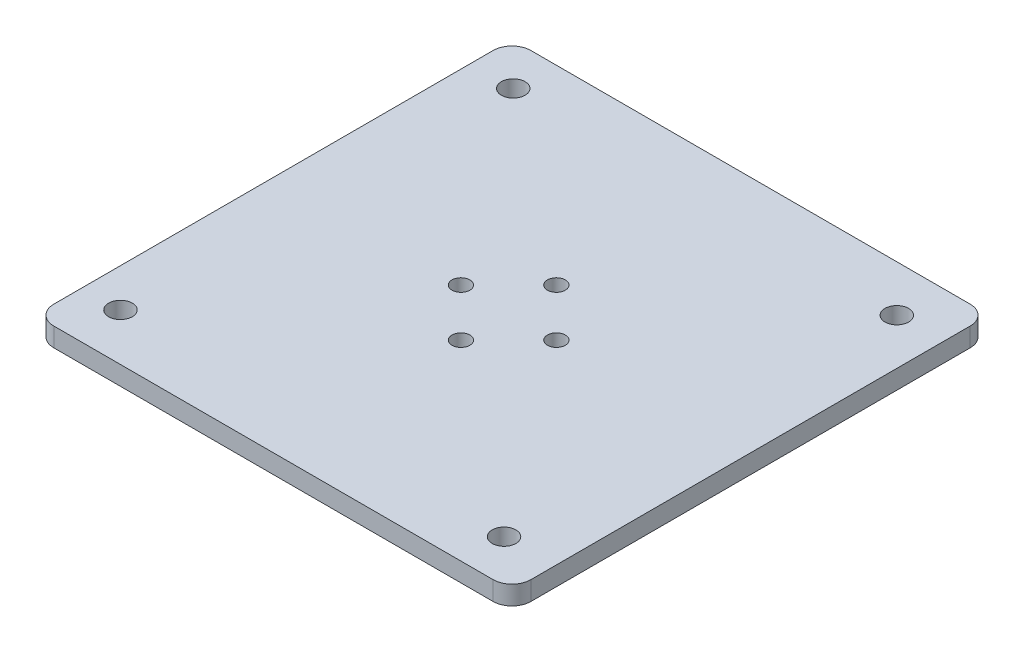
ISO-10303-21;
HEADER;
FILE_DESCRIPTION(('STEP AP214'),'2;1');
FILE_NAME('part.step','',(''),(''),'','','');
FILE_SCHEMA(('AUTOMOTIVE_DESIGN { 1 0 10303 214 1 1 1 1 }'));
ENDSEC;
DATA;
#1=APPLICATION_CONTEXT('core data for automotive mechanical design processes');
#2=APPLICATION_PROTOCOL_DEFINITION('international standard','automotive_design',2000,#1);
#3=PRODUCT_CONTEXT('',#1,'mechanical');
#4=PRODUCT('Part','Part','',(#3));
#5=PRODUCT_RELATED_PRODUCT_CATEGORY('part','',(#4));
#6=PRODUCT_DEFINITION_FORMATION('','',#4);
#7=PRODUCT_DEFINITION_CONTEXT('part definition',#1,'design');
#8=PRODUCT_DEFINITION('design','',#6,#7);
#9=PRODUCT_DEFINITION_SHAPE('','',#8);
#10=(LENGTH_UNIT() NAMED_UNIT(*) SI_UNIT(.MILLI.,.METRE.));
#11=(NAMED_UNIT(*) PLANE_ANGLE_UNIT() SI_UNIT($,.RADIAN.));
#12=(NAMED_UNIT(*) SI_UNIT($,.STERADIAN.) SOLID_ANGLE_UNIT());
#13=UNCERTAINTY_MEASURE_WITH_UNIT(LENGTH_MEASURE(1.E-05),#10,'distance_accuracy_value','');
#14=(GEOMETRIC_REPRESENTATION_CONTEXT(3) GLOBAL_UNCERTAINTY_ASSIGNED_CONTEXT((#13)) GLOBAL_UNIT_ASSIGNED_CONTEXT((#10,
#11,#12)) REPRESENTATION_CONTEXT('',''));
#15=CARTESIAN_POINT('',(0.,0.,0.));
#16=DIRECTION('',(0.,0.,1.));
#17=DIRECTION('',(1.,0.,0.));
#18=AXIS2_PLACEMENT_3D('',#15,#16,#17);
#19=CARTESIAN_POINT('',(-40.,3.175,40.));
#20=DIRECTION('',(1.,0.,0.));
#21=DIRECTION('',(0.,0.,-1.));
#22=AXIS2_PLACEMENT_3D('',#19,#20,#21);
#23=PLANE('',#22);
#24=DIRECTION('',(0.,0.,1.));
#25=VECTOR('',#24,1.);
#26=CARTESIAN_POINT('',(-40.,3.175,40.));
#27=LINE('',#26,#25);
#28=CARTESIAN_POINT('',(-40.,3.175,-36.825));
#29=VERTEX_POINT('',#28);
#30=CARTESIAN_POINT('',(-40.,3.175,36.825));
#31=VERTEX_POINT('',#30);
#32=EDGE_CURVE('E140',#29,#31,#27,.T.);
#33=ORIENTED_EDGE('',*,*,#32,.F.);
#34=DIRECTION('',(0.,-1.,0.));
#35=VECTOR('',#34,1.);
#36=CARTESIAN_POINT('',(-40.,3.175,-36.825));
#37=LINE('',#36,#35);
#38=CARTESIAN_POINT('',(-40.,0.,-36.825));
#39=VERTEX_POINT('',#38);
#40=EDGE_CURVE('E124',#29,#39,#37,.T.);
#41=ORIENTED_EDGE('',*,*,#40,.T.);
#42=DIRECTION('',(0.,0.,1.));
#43=VECTOR('',#42,1.);
#44=CARTESIAN_POINT('',(-40.,0.,40.));
#45=LINE('',#44,#43);
#46=CARTESIAN_POINT('',(-40.,0.,36.825));
#47=VERTEX_POINT('',#46);
#48=EDGE_CURVE('E137',#39,#47,#45,.T.);
#49=ORIENTED_EDGE('',*,*,#48,.T.);
#50=DIRECTION('',(0.,-1.,0.));
#51=VECTOR('',#50,1.);
#52=CARTESIAN_POINT('',(-40.,3.175,36.825));
#53=LINE('',#52,#51);
#54=EDGE_CURVE('E143',#47,#31,#53,.F.);
#55=ORIENTED_EDGE('',*,*,#54,.T.);
#56=EDGE_LOOP('',(#33,#41,#49,#55));
#57=FACE_BOUND('',#56,.T.);
#58=ADVANCED_FACE('F53',(#57),#23,.F.);
#59=CARTESIAN_POINT('',(40.,3.175,40.));
#60=DIRECTION('',(0.,0.,-1.));
#61=DIRECTION('',(-1.,0.,0.));
#62=AXIS2_PLACEMENT_3D('',#59,#60,#61);
#63=PLANE('',#62);
#64=DIRECTION('',(1.,0.,0.));
#65=VECTOR('',#64,1.);
#66=CARTESIAN_POINT('',(40.,0.,40.));
#67=LINE('',#66,#65);
#68=CARTESIAN_POINT('',(-36.825,0.,40.));
#69=VERTEX_POINT('',#68);
#70=CARTESIAN_POINT('',(36.825,0.,40.));
#71=VERTEX_POINT('',#70);
#72=EDGE_CURVE('E148',#69,#71,#67,.T.);
#73=ORIENTED_EDGE('',*,*,#72,.T.);
#74=DIRECTION('',(0.,-1.,0.));
#75=VECTOR('',#74,1.);
#76=CARTESIAN_POINT('',(36.825,3.175,40.));
#77=LINE('',#76,#75);
#78=CARTESIAN_POINT('',(36.825,3.175,40.));
#79=VERTEX_POINT('',#78);
#80=EDGE_CURVE('E13',#71,#79,#77,.F.);
#81=ORIENTED_EDGE('',*,*,#80,.T.);
#82=DIRECTION('',(1.,0.,0.));
#83=VECTOR('',#82,1.);
#84=CARTESIAN_POINT('',(40.,3.175,40.));
#85=LINE('',#84,#83);
#86=CARTESIAN_POINT('',(-36.825,3.175,40.));
#87=VERTEX_POINT('',#86);
#88=EDGE_CURVE('E217',#87,#79,#85,.T.);
#89=ORIENTED_EDGE('',*,*,#88,.F.);
#90=DIRECTION('',(0.,-1.,0.));
#91=VECTOR('',#90,1.);
#92=CARTESIAN_POINT('',(-36.825,3.175,40.));
#93=LINE('',#92,#91);
#94=EDGE_CURVE('E62',#87,#69,#93,.T.);
#95=ORIENTED_EDGE('',*,*,#94,.T.);
#96=EDGE_LOOP('',(#73,#81,#89,#95));
#97=FACE_BOUND('',#96,.T.);
#98=ADVANCED_FACE('F215',(#97),#63,.F.);
#99=CARTESIAN_POINT('',(40.,3.175,40.));
#100=DIRECTION('',(-1.,0.,0.));
#101=DIRECTION('',(0.,0.,1.));
#102=AXIS2_PLACEMENT_3D('',#99,#100,#101);
#103=PLANE('',#102);
#104=DIRECTION('',(0.,0.,-1.));
#105=VECTOR('',#104,1.);
#106=CARTESIAN_POINT('',(40.,0.,40.));
#107=LINE('',#106,#105);
#108=CARTESIAN_POINT('',(40.,0.,36.825));
#109=VERTEX_POINT('',#108);
#110=CARTESIAN_POINT('',(40.,0.,-36.825));
#111=VERTEX_POINT('',#110);
#112=EDGE_CURVE('E154',#109,#111,#107,.T.);
#113=ORIENTED_EDGE('',*,*,#112,.T.);
#114=DIRECTION('',(0.,-1.,0.));
#115=VECTOR('',#114,1.);
#116=CARTESIAN_POINT('',(40.,3.175,-36.825));
#117=LINE('',#116,#115);
#118=CARTESIAN_POINT('',(40.,3.175,-36.825));
#119=VERTEX_POINT('',#118);
#120=EDGE_CURVE('E69',#111,#119,#117,.F.);
#121=ORIENTED_EDGE('',*,*,#120,.T.);
#122=DIRECTION('',(0.,0.,-1.));
#123=VECTOR('',#122,1.);
#124=CARTESIAN_POINT('',(40.,3.175,40.));
#125=LINE('',#124,#123);
#126=CARTESIAN_POINT('',(40.,3.175,36.825));
#127=VERTEX_POINT('',#126);
#128=EDGE_CURVE('E225',#127,#119,#125,.T.);
#129=ORIENTED_EDGE('',*,*,#128,.F.);
#130=DIRECTION('',(0.,-1.,0.));
#131=VECTOR('',#130,1.);
#132=CARTESIAN_POINT('',(40.,3.175,36.825));
#133=LINE('',#132,#131);
#134=EDGE_CURVE('E205',#127,#109,#133,.T.);
#135=ORIENTED_EDGE('',*,*,#134,.T.);
#136=EDGE_LOOP('',(#113,#121,#129,#135));
#137=FACE_BOUND('',#136,.T.);
#138=ADVANCED_FACE('F224',(#137),#103,.F.);
#139=CARTESIAN_POINT('',(40.,3.175,-40.));
#140=DIRECTION('',(0.,0.,1.));
#141=DIRECTION('',(1.,0.,0.));
#142=AXIS2_PLACEMENT_3D('',#139,#140,#141);
#143=PLANE('',#142);
#144=DIRECTION('',(-1.,0.,0.));
#145=VECTOR('',#144,1.);
#146=CARTESIAN_POINT('',(40.,0.,-40.));
#147=LINE('',#146,#145);
#148=CARTESIAN_POINT('',(36.825,0.,-40.));
#149=VERTEX_POINT('',#148);
#150=CARTESIAN_POINT('',(-36.825,0.,-40.));
#151=VERTEX_POINT('',#150);
#152=EDGE_CURVE('E165',#149,#151,#147,.T.);
#153=ORIENTED_EDGE('',*,*,#152,.T.);
#154=DIRECTION('',(0.,-1.,0.));
#155=VECTOR('',#154,1.);
#156=CARTESIAN_POINT('',(-36.825,3.175,-40.));
#157=LINE('',#156,#155);
#158=CARTESIAN_POINT('',(-36.825,3.175,-40.));
#159=VERTEX_POINT('',#158);
#160=EDGE_CURVE('E125',#151,#159,#157,.F.);
#161=ORIENTED_EDGE('',*,*,#160,.T.);
#162=DIRECTION('',(-1.,0.,0.));
#163=VECTOR('',#162,1.);
#164=CARTESIAN_POINT('',(40.,3.175,-40.));
#165=LINE('',#164,#163);
#166=CARTESIAN_POINT('',(36.825,3.175,-40.));
#167=VERTEX_POINT('',#166);
#168=EDGE_CURVE('E160',#167,#159,#165,.T.);
#169=ORIENTED_EDGE('',*,*,#168,.F.);
#170=DIRECTION('',(0.,-1.,0.));
#171=VECTOR('',#170,1.);
#172=CARTESIAN_POINT('',(36.825,3.175,-40.));
#173=LINE('',#172,#171);
#174=EDGE_CURVE('E131',#167,#149,#173,.T.);
#175=ORIENTED_EDGE('',*,*,#174,.T.);
#176=EDGE_LOOP('',(#153,#161,#169,#175));
#177=FACE_BOUND('',#176,.T.);
#178=ADVANCED_FACE('F344',(#177),#143,.F.);
#179=CARTESIAN_POINT('',(0.,3.175,0.));
#180=DIRECTION('',(0.,1.,0.));
#181=DIRECTION('',(0.,0.,1.));
#182=AXIS2_PLACEMENT_3D('',#179,#180,#181);
#183=PLANE('',#182);
#184=CARTESIAN_POINT('',(-0.640000000000008,3.175,-8.07999999999998));
#185=DIRECTION('',(0.,1.,0.));
#186=DIRECTION('',(0.,0.,1.));
#187=AXIS2_PLACEMENT_3D('',#184,#185,#186);
#188=CIRCLE('',#187,1.5);
#189=CARTESIAN_POINT('',(-0.640000000000008,3.175,-6.57999999999998));
#190=VERTEX_POINT('',#189);
#191=EDGE_CURVE('E244',#190,#190,#188,.T.);
#192=ORIENTED_EDGE('',*,*,#191,.F.);
#193=EDGE_LOOP('',(#192));
#194=FACE_BOUND('',#193,.T.);
#195=CARTESIAN_POINT('',(-8.64000000000001,3.175,-0.0799999999999774));
#196=DIRECTION('',(0.,1.,0.));
#197=DIRECTION('',(0.,0.,1.));
#198=AXIS2_PLACEMENT_3D('',#195,#196,#197);
#199=CIRCLE('',#198,1.5);
#200=CARTESIAN_POINT('',(-8.64000000000001,3.175,1.42000000000002));
#201=VERTEX_POINT('',#200);
#202=EDGE_CURVE('E254',#201,#201,#199,.T.);
#203=ORIENTED_EDGE('',*,*,#202,.F.);
#204=EDGE_LOOP('',(#203));
#205=FACE_BOUND('',#204,.T.);
#206=CARTESIAN_POINT('',(-0.640000000000009,3.175,7.92000000000002));
#207=DIRECTION('',(0.,1.,0.));
#208=DIRECTION('',(0.,0.,1.));
#209=AXIS2_PLACEMENT_3D('',#206,#207,#208);
#210=CIRCLE('',#209,1.5);
#211=CARTESIAN_POINT('',(-0.640000000000009,3.175,9.42000000000002));
#212=VERTEX_POINT('',#211);
#213=EDGE_CURVE('E258',#212,#212,#210,.T.);
#214=ORIENTED_EDGE('',*,*,#213,.F.);
#215=EDGE_LOOP('',(#214));
#216=FACE_BOUND('',#215,.T.);
#217=CARTESIAN_POINT('',(7.35999999999999,3.175,-0.0799999999999754));
#218=DIRECTION('',(0.,1.,0.));
#219=DIRECTION('',(0.,0.,1.));
#220=AXIS2_PLACEMENT_3D('',#217,#218,#219);
#221=CIRCLE('',#220,1.5);
#222=CARTESIAN_POINT('',(7.35999999999999,3.175,1.42000000000003));
#223=VERTEX_POINT('',#222);
#224=EDGE_CURVE('E262',#223,#223,#221,.T.);
#225=ORIENTED_EDGE('',*,*,#224,.F.);
#226=EDGE_LOOP('',(#225));
#227=FACE_BOUND('',#226,.T.);
#228=CARTESIAN_POINT('',(-33.5701257846403,3.175,32.0771903548223));
#229=DIRECTION('',(0.,1.,0.));
#230=DIRECTION('',(0.,0.,1.));
#231=AXIS2_PLACEMENT_3D('',#228,#229,#230);
#232=CIRCLE('',#231,1.984375);
#233=CARTESIAN_POINT('',(-33.5701257846403,3.175,34.0615653548223));
#234=VERTEX_POINT('',#233);
#235=EDGE_CURVE('E239',#234,#234,#232,.T.);
#236=ORIENTED_EDGE('',*,*,#235,.F.);
#237=EDGE_LOOP('',(#236));
#238=FACE_BOUND('',#237,.T.);
#239=CARTESIAN_POINT('',(31.5128275965497,3.175,32.8464987662245));
#240=DIRECTION('',(0.,1.,0.));
#241=DIRECTION('',(0.,0.,1.));
#242=AXIS2_PLACEMENT_3D('',#239,#240,#241);
#243=CIRCLE('',#242,1.98437500000001);
#244=CARTESIAN_POINT('',(31.5128275965497,3.175,34.8308737662245));
#245=VERTEX_POINT('',#244);
#246=EDGE_CURVE('E243',#245,#245,#243,.T.);
#247=ORIENTED_EDGE('',*,*,#246,.F.);
#248=EDGE_LOOP('',(#247));
#249=FACE_BOUND('',#248,.T.);
#250=CARTESIAN_POINT('',(32.2821360079519,3.175,-32.2364546149654));
#251=DIRECTION('',(0.,1.,0.));
#252=DIRECTION('',(0.,0.,1.));
#253=AXIS2_PLACEMENT_3D('',#250,#251,#252);
#254=CIRCLE('',#253,1.98437499999999);
#255=CARTESIAN_POINT('',(32.2821360079519,3.175,-30.2520796149654));
#256=VERTEX_POINT('',#255);
#257=EDGE_CURVE('E238',#256,#256,#254,.T.);
#258=ORIENTED_EDGE('',*,*,#257,.F.);
#259=EDGE_LOOP('',(#258));
#260=FACE_BOUND('',#259,.T.);
#261=CARTESIAN_POINT('',(-32.8008173732381,3.175,-33.0057630263676));
#262=DIRECTION('',(0.,1.,0.));
#263=DIRECTION('',(0.,0.,1.));
#264=AXIS2_PLACEMENT_3D('',#261,#262,#263);
#265=CIRCLE('',#264,1.98437499999999);
#266=CARTESIAN_POINT('',(-32.8008173732381,3.175,-31.0213880263676));
#267=VERTEX_POINT('',#266);
#268=EDGE_CURVE('E173',#267,#267,#265,.T.);
#269=ORIENTED_EDGE('',*,*,#268,.F.);
#270=EDGE_LOOP('',(#269));
#271=FACE_BOUND('',#270,.T.);
#272=ORIENTED_EDGE('',*,*,#168,.T.);
#273=CARTESIAN_POINT('',(-36.825,3.175,-36.825));
#274=DIRECTION('',(0.,1.,0.));
#275=DIRECTION('',(0.,0.,1.));
#276=AXIS2_PLACEMENT_3D('',#273,#274,#275);
#277=CIRCLE('',#276,3.175);
#278=EDGE_CURVE('E202',#159,#29,#277,.T.);
#279=ORIENTED_EDGE('',*,*,#278,.T.);
#280=ORIENTED_EDGE('',*,*,#32,.T.);
#281=CARTESIAN_POINT('',(-36.825,3.175,36.825));
#282=DIRECTION('',(0.,1.,0.));
#283=DIRECTION('',(0.,0.,1.));
#284=AXIS2_PLACEMENT_3D('',#281,#282,#283);
#285=CIRCLE('',#284,3.175);
#286=EDGE_CURVE('E194',#31,#87,#285,.T.);
#287=ORIENTED_EDGE('',*,*,#286,.T.);
#288=ORIENTED_EDGE('',*,*,#88,.T.);
#289=CARTESIAN_POINT('',(36.825,3.175,36.825));
#290=DIRECTION('',(0.,1.,0.));
#291=DIRECTION('',(0.,0.,1.));
#292=AXIS2_PLACEMENT_3D('',#289,#290,#291);
#293=CIRCLE('',#292,3.175);
#294=EDGE_CURVE('E76',#79,#127,#293,.T.);
#295=ORIENTED_EDGE('',*,*,#294,.T.);
#296=ORIENTED_EDGE('',*,*,#128,.T.);
#297=CARTESIAN_POINT('',(36.825,3.175,-36.825));
#298=DIRECTION('',(0.,1.,0.));
#299=DIRECTION('',(0.,0.,1.));
#300=AXIS2_PLACEMENT_3D('',#297,#298,#299);
#301=CIRCLE('',#300,3.175);
#302=EDGE_CURVE('E199',#119,#167,#301,.T.);
#303=ORIENTED_EDGE('',*,*,#302,.T.);
#304=EDGE_LOOP('',(#272,#279,#280,#287,#288,#295,#296,#303));
#305=FACE_BOUND('',#304,.T.);
#306=ADVANCED_FACE('F288',(#194,#205,#216,#227,#238,#249,#260,#271,#305),#183,.T.);
#307=CARTESIAN_POINT('',(0.,0.,0.));
#308=DIRECTION('',(0.,1.,0.));
#309=DIRECTION('',(0.,0.,1.));
#310=AXIS2_PLACEMENT_3D('',#307,#308,#309);
#311=PLANE('',#310);
#312=CARTESIAN_POINT('',(-0.640000000000008,0.,-8.07999999999998));
#313=DIRECTION('',(0.,-1.,0.));
#314=DIRECTION('',(0.,0.,-1.));
#315=AXIS2_PLACEMENT_3D('',#312,#313,#314);
#316=CIRCLE('',#315,1.5);
#317=CARTESIAN_POINT('',(-0.640000000000008,0.,-9.57999999999998));
#318=VERTEX_POINT('',#317);
#319=EDGE_CURVE('E266',#318,#318,#316,.T.);
#320=ORIENTED_EDGE('',*,*,#319,.F.);
#321=EDGE_LOOP('',(#320));
#322=FACE_BOUND('',#321,.T.);
#323=CARTESIAN_POINT('',(-8.64000000000001,0.,-0.0799999999999774));
#324=DIRECTION('',(0.,-1.,0.));
#325=DIRECTION('',(0.,0.,-1.));
#326=AXIS2_PLACEMENT_3D('',#323,#324,#325);
#327=CIRCLE('',#326,1.5);
#328=CARTESIAN_POINT('',(-8.64000000000001,0.,-1.57999999999998));
#329=VERTEX_POINT('',#328);
#330=EDGE_CURVE('E275',#329,#329,#327,.T.);
#331=ORIENTED_EDGE('',*,*,#330,.F.);
#332=EDGE_LOOP('',(#331));
#333=FACE_BOUND('',#332,.T.);
#334=CARTESIAN_POINT('',(-0.640000000000009,0.,7.92000000000002));
#335=DIRECTION('',(0.,-1.,0.));
#336=DIRECTION('',(0.,0.,-1.));
#337=AXIS2_PLACEMENT_3D('',#334,#335,#336);
#338=CIRCLE('',#337,1.5);
#339=CARTESIAN_POINT('',(-0.640000000000009,0.,6.42000000000002));
#340=VERTEX_POINT('',#339);
#341=EDGE_CURVE('E271',#340,#340,#338,.T.);
#342=ORIENTED_EDGE('',*,*,#341,.F.);
#343=EDGE_LOOP('',(#342));
#344=FACE_BOUND('',#343,.T.);
#345=CARTESIAN_POINT('',(7.35999999999999,0.,-0.0799999999999754));
#346=DIRECTION('',(0.,-1.,0.));
#347=DIRECTION('',(0.,0.,-1.));
#348=AXIS2_PLACEMENT_3D('',#345,#346,#347);
#349=CIRCLE('',#348,1.5);
#350=CARTESIAN_POINT('',(7.35999999999999,0.,-1.57999999999998));
#351=VERTEX_POINT('',#350);
#352=EDGE_CURVE('E267',#351,#351,#349,.T.);
#353=ORIENTED_EDGE('',*,*,#352,.F.);
#354=EDGE_LOOP('',(#353));
#355=FACE_BOUND('',#354,.T.);
#356=CARTESIAN_POINT('',(-33.5701257846403,0.,32.0771903548223));
#357=DIRECTION('',(0.,1.,0.));
#358=DIRECTION('',(0.,0.,1.));
#359=AXIS2_PLACEMENT_3D('',#356,#357,#358);
#360=CIRCLE('',#359,1.984375);
#361=CARTESIAN_POINT('',(-33.5701257846403,0.,34.0615653548223));
#362=VERTEX_POINT('',#361);
#363=EDGE_CURVE('E149',#362,#362,#360,.T.);
#364=ORIENTED_EDGE('',*,*,#363,.T.);
#365=EDGE_LOOP('',(#364));
#366=FACE_BOUND('',#365,.T.);
#367=CARTESIAN_POINT('',(31.5128275965497,0.,32.8464987662245));
#368=DIRECTION('',(0.,1.,0.));
#369=DIRECTION('',(0.,0.,1.));
#370=AXIS2_PLACEMENT_3D('',#367,#368,#369);
#371=CIRCLE('',#370,1.98437500000001);
#372=CARTESIAN_POINT('',(31.5128275965497,0.,34.8308737662245));
#373=VERTEX_POINT('',#372);
#374=EDGE_CURVE('E157',#373,#373,#371,.T.);
#375=ORIENTED_EDGE('',*,*,#374,.T.);
#376=EDGE_LOOP('',(#375));
#377=FACE_BOUND('',#376,.T.);
#378=CARTESIAN_POINT('',(32.2821360079519,0.,-32.2364546149654));
#379=DIRECTION('',(0.,1.,0.));
#380=DIRECTION('',(0.,0.,1.));
#381=AXIS2_PLACEMENT_3D('',#378,#379,#380);
#382=CIRCLE('',#381,1.98437499999999);
#383=CARTESIAN_POINT('',(32.2821360079519,0.,-30.2520796149654));
#384=VERTEX_POINT('',#383);
#385=EDGE_CURVE('E172',#384,#384,#382,.T.);
#386=ORIENTED_EDGE('',*,*,#385,.T.);
#387=EDGE_LOOP('',(#386));
#388=FACE_BOUND('',#387,.T.);
#389=CARTESIAN_POINT('',(-32.8008173732381,0.,-33.0057630263676));
#390=DIRECTION('',(0.,1.,0.));
#391=DIRECTION('',(0.,0.,1.));
#392=AXIS2_PLACEMENT_3D('',#389,#390,#391);
#393=CIRCLE('',#392,1.98437499999999);
#394=CARTESIAN_POINT('',(-32.8008173732381,0.,-31.0213880263676));
#395=VERTEX_POINT('',#394);
#396=EDGE_CURVE('E168',#395,#395,#393,.T.);
#397=ORIENTED_EDGE('',*,*,#396,.T.);
#398=EDGE_LOOP('',(#397));
#399=FACE_BOUND('',#398,.T.);
#400=ORIENTED_EDGE('',*,*,#48,.F.);
#401=CARTESIAN_POINT('',(-36.825,0.,-36.825));
#402=DIRECTION('',(0.,1.,0.));
#403=DIRECTION('',(0.,0.,1.));
#404=AXIS2_PLACEMENT_3D('',#401,#402,#403);
#405=CIRCLE('',#404,3.175);
#406=EDGE_CURVE('E120',#39,#151,#405,.F.);
#407=ORIENTED_EDGE('',*,*,#406,.T.);
#408=ORIENTED_EDGE('',*,*,#152,.F.);
#409=CARTESIAN_POINT('',(36.825,0.,-36.825));
#410=DIRECTION('',(0.,1.,0.));
#411=DIRECTION('',(0.,0.,1.));
#412=AXIS2_PLACEMENT_3D('',#409,#410,#411);
#413=CIRCLE('',#412,3.175);
#414=EDGE_CURVE('E132',#149,#111,#413,.F.);
#415=ORIENTED_EDGE('',*,*,#414,.T.);
#416=ORIENTED_EDGE('',*,*,#112,.F.);
#417=CARTESIAN_POINT('',(36.825,0.,36.825));
#418=DIRECTION('',(0.,1.,0.));
#419=DIRECTION('',(0.,0.,1.));
#420=AXIS2_PLACEMENT_3D('',#417,#418,#419);
#421=CIRCLE('',#420,3.175);
#422=EDGE_CURVE('E184',#109,#71,#421,.F.);
#423=ORIENTED_EDGE('',*,*,#422,.T.);
#424=ORIENTED_EDGE('',*,*,#72,.F.);
#425=CARTESIAN_POINT('',(-36.825,0.,36.825));
#426=DIRECTION('',(0.,1.,0.));
#427=DIRECTION('',(0.,0.,1.));
#428=AXIS2_PLACEMENT_3D('',#425,#426,#427);
#429=CIRCLE('',#428,3.175);
#430=EDGE_CURVE('E142',#69,#47,#429,.F.);
#431=ORIENTED_EDGE('',*,*,#430,.T.);
#432=EDGE_LOOP('',(#400,#407,#408,#415,#416,#423,#424,#431));
#433=FACE_BOUND('',#432,.T.);
#434=ADVANCED_FACE('F145',(#322,#333,#344,#355,#366,#377,#388,#399,#433),#311,.F.);
#435=CARTESIAN_POINT('',(-32.8008173732381,-6.825,-33.0057630263676));
#436=DIRECTION('',(0.,1.,0.));
#437=DIRECTION('',(0.,0.,1.));
#438=AXIS2_PLACEMENT_3D('',#435,#436,#437);
#439=CYLINDRICAL_SURFACE('',#438,1.98437499999999);
#440=ORIENTED_EDGE('',*,*,#268,.T.);
#441=EDGE_LOOP('',(#440));
#442=FACE_BOUND('',#441,.T.);
#443=ORIENTED_EDGE('',*,*,#396,.F.);
#444=EDGE_LOOP('',(#443));
#445=FACE_BOUND('',#444,.T.);
#446=ADVANCED_FACE('F287',(#442,#445),#439,.F.);
#447=CARTESIAN_POINT('',(32.2821360079519,-6.825,-32.2364546149654));
#448=DIRECTION('',(0.,1.,0.));
#449=DIRECTION('',(0.,0.,1.));
#450=AXIS2_PLACEMENT_3D('',#447,#448,#449);
#451=CYLINDRICAL_SURFACE('',#450,1.98437499999999);
#452=ORIENTED_EDGE('',*,*,#257,.T.);
#453=EDGE_LOOP('',(#452));
#454=FACE_BOUND('',#453,.T.);
#455=ORIENTED_EDGE('',*,*,#385,.F.);
#456=EDGE_LOOP('',(#455));
#457=FACE_BOUND('',#456,.T.);
#458=ADVANCED_FACE('F305',(#454,#457),#451,.F.);
#459=CARTESIAN_POINT('',(31.5128275965497,-6.825,32.8464987662245));
#460=DIRECTION('',(0.,1.,0.));
#461=DIRECTION('',(0.,0.,1.));
#462=AXIS2_PLACEMENT_3D('',#459,#460,#461);
#463=CYLINDRICAL_SURFACE('',#462,1.98437500000001);
#464=ORIENTED_EDGE('',*,*,#246,.T.);
#465=EDGE_LOOP('',(#464));
#466=FACE_BOUND('',#465,.T.);
#467=ORIENTED_EDGE('',*,*,#374,.F.);
#468=EDGE_LOOP('',(#467));
#469=FACE_BOUND('',#468,.T.);
#470=ADVANCED_FACE('F311',(#466,#469),#463,.F.);
#471=CARTESIAN_POINT('',(-33.5701257846403,-6.825,32.0771903548223));
#472=DIRECTION('',(0.,1.,0.));
#473=DIRECTION('',(0.,0.,1.));
#474=AXIS2_PLACEMENT_3D('',#471,#472,#473);
#475=CYLINDRICAL_SURFACE('',#474,1.984375);
#476=ORIENTED_EDGE('',*,*,#235,.T.);
#477=EDGE_LOOP('',(#476));
#478=FACE_BOUND('',#477,.T.);
#479=ORIENTED_EDGE('',*,*,#363,.F.);
#480=EDGE_LOOP('',(#479));
#481=FACE_BOUND('',#480,.T.);
#482=ADVANCED_FACE('F327',(#478,#481),#475,.F.);
#483=CARTESIAN_POINT('',(-36.825,3.175,-36.825));
#484=DIRECTION('',(0.,-1.,0.));
#485=DIRECTION('',(0.,0.,-1.));
#486=AXIS2_PLACEMENT_3D('',#483,#484,#485);
#487=CYLINDRICAL_SURFACE('',#486,3.175);
#488=ORIENTED_EDGE('',*,*,#278,.F.);
#489=ORIENTED_EDGE('',*,*,#160,.F.);
#490=ORIENTED_EDGE('',*,*,#406,.F.);
#491=ORIENTED_EDGE('',*,*,#40,.F.);
#492=EDGE_LOOP('',(#488,#489,#490,#491));
#493=FACE_BOUND('',#492,.T.);
#494=ADVANCED_FACE('F123',(#493),#487,.T.);
#495=CARTESIAN_POINT('',(36.825,3.175,-36.825));
#496=DIRECTION('',(0.,-1.,0.));
#497=DIRECTION('',(0.,0.,-1.));
#498=AXIS2_PLACEMENT_3D('',#495,#496,#497);
#499=CYLINDRICAL_SURFACE('',#498,3.175);
#500=ORIENTED_EDGE('',*,*,#302,.F.);
#501=ORIENTED_EDGE('',*,*,#120,.F.);
#502=ORIENTED_EDGE('',*,*,#414,.F.);
#503=ORIENTED_EDGE('',*,*,#174,.F.);
#504=EDGE_LOOP('',(#500,#501,#502,#503));
#505=FACE_BOUND('',#504,.T.);
#506=ADVANCED_FACE('F326',(#505),#499,.T.);
#507=CARTESIAN_POINT('',(36.825,3.175,36.825));
#508=DIRECTION('',(0.,-1.,0.));
#509=DIRECTION('',(0.,0.,-1.));
#510=AXIS2_PLACEMENT_3D('',#507,#508,#509);
#511=CYLINDRICAL_SURFACE('',#510,3.175);
#512=ORIENTED_EDGE('',*,*,#294,.F.);
#513=ORIENTED_EDGE('',*,*,#80,.F.);
#514=ORIENTED_EDGE('',*,*,#422,.F.);
#515=ORIENTED_EDGE('',*,*,#134,.F.);
#516=EDGE_LOOP('',(#512,#513,#514,#515));
#517=FACE_BOUND('',#516,.T.);
#518=ADVANCED_FACE('F223',(#517),#511,.T.);
#519=CARTESIAN_POINT('',(-36.825,3.175,36.825));
#520=DIRECTION('',(0.,-1.,0.));
#521=DIRECTION('',(0.,0.,-1.));
#522=AXIS2_PLACEMENT_3D('',#519,#520,#521);
#523=CYLINDRICAL_SURFACE('',#522,3.175);
#524=ORIENTED_EDGE('',*,*,#286,.F.);
#525=ORIENTED_EDGE('',*,*,#54,.F.);
#526=ORIENTED_EDGE('',*,*,#430,.F.);
#527=ORIENTED_EDGE('',*,*,#94,.F.);
#528=EDGE_LOOP('',(#524,#525,#526,#527));
#529=FACE_BOUND('',#528,.T.);
#530=ADVANCED_FACE('F55',(#529),#523,.T.);
#531=CARTESIAN_POINT('',(7.35999999999999,10.,-0.0799999999999754));
#532=DIRECTION('',(0.,-1.,0.));
#533=DIRECTION('',(0.,0.,-1.));
#534=AXIS2_PLACEMENT_3D('',#531,#532,#533);
#535=CYLINDRICAL_SURFACE('',#534,1.5);
#536=ORIENTED_EDGE('',*,*,#224,.T.);
#537=EDGE_LOOP('',(#536));
#538=FACE_BOUND('',#537,.T.);
#539=ORIENTED_EDGE('',*,*,#352,.T.);
#540=EDGE_LOOP('',(#539));
#541=FACE_BOUND('',#540,.T.);
#542=ADVANCED_FACE('F334',(#538,#541),#535,.F.);
#543=CARTESIAN_POINT('',(-0.640000000000009,10.,7.92000000000002));
#544=DIRECTION('',(0.,-1.,0.));
#545=DIRECTION('',(0.,0.,-1.));
#546=AXIS2_PLACEMENT_3D('',#543,#544,#545);
#547=CYLINDRICAL_SURFACE('',#546,1.5);
#548=ORIENTED_EDGE('',*,*,#213,.T.);
#549=EDGE_LOOP('',(#548));
#550=FACE_BOUND('',#549,.T.);
#551=ORIENTED_EDGE('',*,*,#341,.T.);
#552=EDGE_LOOP('',(#551));
#553=FACE_BOUND('',#552,.T.);
#554=ADVANCED_FACE('F338',(#550,#553),#547,.F.);
#555=CARTESIAN_POINT('',(-8.64000000000001,10.,-0.0799999999999774));
#556=DIRECTION('',(0.,-1.,0.));
#557=DIRECTION('',(0.,0.,-1.));
#558=AXIS2_PLACEMENT_3D('',#555,#556,#557);
#559=CYLINDRICAL_SURFACE('',#558,1.5);
#560=ORIENTED_EDGE('',*,*,#202,.T.);
#561=EDGE_LOOP('',(#560));
#562=FACE_BOUND('',#561,.T.);
#563=ORIENTED_EDGE('',*,*,#330,.T.);
#564=EDGE_LOOP('',(#563));
#565=FACE_BOUND('',#564,.T.);
#566=ADVANCED_FACE('F465',(#562,#565),#559,.F.);
#567=CARTESIAN_POINT('',(-0.640000000000008,10.,-8.07999999999998));
#568=DIRECTION('',(0.,-1.,0.));
#569=DIRECTION('',(0.,0.,-1.));
#570=AXIS2_PLACEMENT_3D('',#567,#568,#569);
#571=CYLINDRICAL_SURFACE('',#570,1.5);
#572=ORIENTED_EDGE('',*,*,#191,.T.);
#573=EDGE_LOOP('',(#572));
#574=FACE_BOUND('',#573,.T.);
#575=ORIENTED_EDGE('',*,*,#319,.T.);
#576=EDGE_LOOP('',(#575));
#577=FACE_BOUND('',#576,.T.);
#578=ADVANCED_FACE('F283',(#574,#577),#571,.F.);
#579=CLOSED_SHELL('',(#58,#98,#138,#178,#306,#434,#446,#458,#470,#482,#494,#506,#518,#530,#542,
#554,#566,#578));
#580=MANIFOLD_SOLID_BREP('B2',#579);
#581=ADVANCED_BREP_SHAPE_REPRESENTATION('',(#18,#580),#14);
#582=SHAPE_DEFINITION_REPRESENTATION(#9,#581);
ENDSEC;
END-ISO-10303-21;
